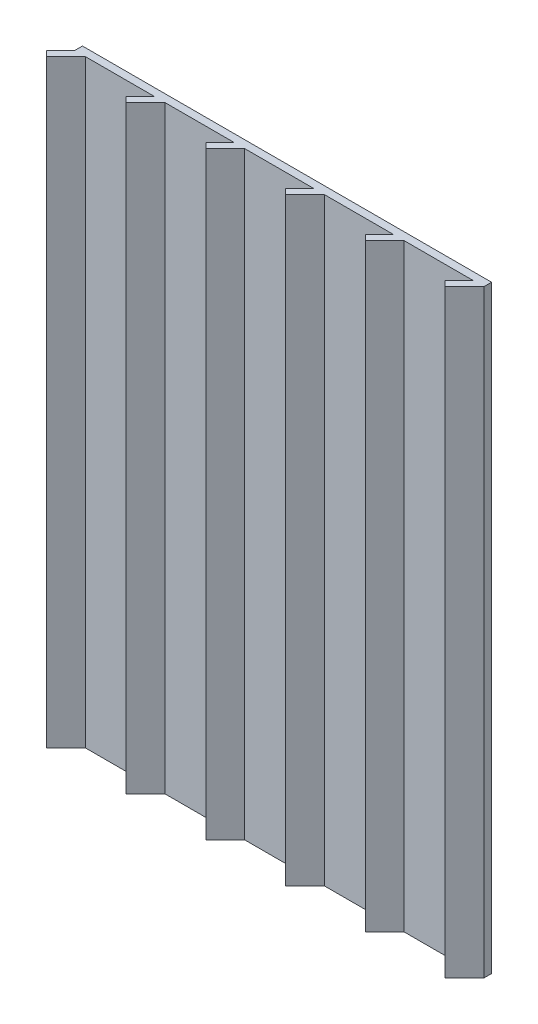
ISO-10303-21;
HEADER;
FILE_DESCRIPTION(('STEP AP214'),'2;1');
FILE_NAME('part.step','',(''),(''),'','','');
FILE_SCHEMA(('AUTOMOTIVE_DESIGN { 1 0 10303 214 1 1 1 1 }'));
ENDSEC;
DATA;
#1=APPLICATION_CONTEXT('core data for automotive mechanical design processes');
#2=APPLICATION_PROTOCOL_DEFINITION('international standard','automotive_design',2000,#1);
#3=PRODUCT_CONTEXT('',#1,'mechanical');
#4=PRODUCT('Part','Part','',(#3));
#5=PRODUCT_RELATED_PRODUCT_CATEGORY('part','',(#4));
#6=PRODUCT_DEFINITION_FORMATION('','',#4);
#7=PRODUCT_DEFINITION_CONTEXT('part definition',#1,'design');
#8=PRODUCT_DEFINITION('design','',#6,#7);
#9=PRODUCT_DEFINITION_SHAPE('','',#8);
#10=(LENGTH_UNIT() NAMED_UNIT(*) SI_UNIT(.MILLI.,.METRE.));
#11=(NAMED_UNIT(*) PLANE_ANGLE_UNIT() SI_UNIT($,.RADIAN.));
#12=(NAMED_UNIT(*) SI_UNIT($,.STERADIAN.) SOLID_ANGLE_UNIT());
#13=UNCERTAINTY_MEASURE_WITH_UNIT(LENGTH_MEASURE(1.E-05),#10,'distance_accuracy_value','');
#14=(GEOMETRIC_REPRESENTATION_CONTEXT(3) GLOBAL_UNCERTAINTY_ASSIGNED_CONTEXT((#13)) GLOBAL_UNIT_ASSIGNED_CONTEXT((#10,
#11,#12)) REPRESENTATION_CONTEXT('',''));
#15=CARTESIAN_POINT('',(0.,0.,0.));
#16=DIRECTION('',(0.,0.,1.));
#17=DIRECTION('',(1.,0.,0.));
#18=AXIS2_PLACEMENT_3D('',#15,#16,#17);
#19=CARTESIAN_POINT('',(-2.06748602975986,-25.4,1.0795));
#20=DIRECTION('',(0.707106781186547,0.,0.707106781186548));
#21=DIRECTION('',(0.707106781186548,0.,-0.707106781186547));
#22=AXIS2_PLACEMENT_3D('',#19,#20,#21);
#23=PLANE('',#22);
#24=DIRECTION('',(0.707106781186548,0.,-0.707106781186547));
#25=VECTOR('',#24,1.);
#26=CARTESIAN_POINT('',(-2.06748602975986,25.4,1.0795));
#27=LINE('',#26,#25);
#28=CARTESIAN_POINT('',(-2.89298602975984,25.4,1.905));
#29=VERTEX_POINT('',#28);
#30=CARTESIAN_POINT('',(-1.24198602975986,25.4,0.254));
#31=VERTEX_POINT('',#30);
#32=EDGE_CURVE('E317',#29,#31,#27,.T.);
#33=ORIENTED_EDGE('',*,*,#32,.F.);
#34=DIRECTION('',(0.,1.,0.));
#35=VECTOR('',#34,1.);
#36=CARTESIAN_POINT('',(-2.89298602975984,-25.4,1.905));
#37=LINE('',#36,#35);
#38=CARTESIAN_POINT('',(-2.89298602975984,-25.4,1.905));
#39=VERTEX_POINT('',#38);
#40=EDGE_CURVE('E314',#39,#29,#37,.T.);
#41=ORIENTED_EDGE('',*,*,#40,.F.);
#42=DIRECTION('',(0.707106781186548,0.,-0.707106781186547));
#43=VECTOR('',#42,1.);
#44=CARTESIAN_POINT('',(-2.06748602975986,-25.4,1.0795));
#45=LINE('',#44,#43);
#46=CARTESIAN_POINT('',(-1.24198602975986,-25.4,0.254));
#47=VERTEX_POINT('',#46);
#48=EDGE_CURVE('E311',#39,#47,#45,.T.);
#49=ORIENTED_EDGE('',*,*,#48,.T.);
#50=DIRECTION('',(0.,1.,0.));
#51=VECTOR('',#50,1.);
#52=CARTESIAN_POINT('',(-1.24198602975986,-25.4,0.254));
#53=LINE('',#52,#51);
#54=EDGE_CURVE('E11',#47,#31,#53,.T.);
#55=ORIENTED_EDGE('',*,*,#54,.T.);
#56=EDGE_LOOP('',(#33,#41,#49,#55));
#57=FACE_BOUND('',#56,.T.);
#58=ADVANCED_FACE('F45',(#57),#23,.T.);
#59=CARTESIAN_POINT('',(-3.11749243278657,-25.4,1.68049359697328));
#60=DIRECTION('',(0.707106781186548,0.,-0.707106781186547));
#61=DIRECTION('',(-0.707106781186547,0.,-0.707106781186548));
#62=AXIS2_PLACEMENT_3D('',#59,#60,#61);
#63=PLANE('',#62);
#64=DIRECTION('',(-0.707106781186547,0.,-0.707106781186548));
#65=VECTOR('',#64,1.);
#66=CARTESIAN_POINT('',(-3.11749243278657,25.4,1.68049359697328));
#67=LINE('',#66,#65);
#68=CARTESIAN_POINT('',(-3.3419988358133,25.4,1.45598719394654));
#69=VERTEX_POINT('',#68);
#70=EDGE_CURVE('E309',#29,#69,#67,.T.);
#71=ORIENTED_EDGE('',*,*,#70,.T.);
#72=DIRECTION('',(0.,1.,0.));
#73=VECTOR('',#72,1.);
#74=CARTESIAN_POINT('',(-3.3419988358133,-25.4,1.45598719394654));
#75=LINE('',#74,#73);
#76=CARTESIAN_POINT('',(-3.3419988358133,-25.4,1.45598719394654));
#77=VERTEX_POINT('',#76);
#78=EDGE_CURVE('E306',#77,#69,#75,.T.);
#79=ORIENTED_EDGE('',*,*,#78,.F.);
#80=DIRECTION('',(-0.707106781186547,0.,-0.707106781186548));
#81=VECTOR('',#80,1.);
#82=CARTESIAN_POINT('',(-3.11749243278657,-25.4,1.68049359697328));
#83=LINE('',#82,#81);
#84=EDGE_CURVE('E303',#39,#77,#83,.T.);
#85=ORIENTED_EDGE('',*,*,#84,.F.);
#86=ORIENTED_EDGE('',*,*,#40,.T.);
#87=EDGE_LOOP('',(#71,#79,#85,#86));
#88=FACE_BOUND('',#87,.T.);
#89=ADVANCED_FACE('F465',(#88),#63,.F.);
#90=CARTESIAN_POINT('',(-2.74100523884004,-25.4,0.854993596973269));
#91=DIRECTION('',(0.707106781186547,0.,0.707106781186548));
#92=DIRECTION('',(0.707106781186548,0.,-0.707106781186547));
#93=AXIS2_PLACEMENT_3D('',#90,#91,#92);
#94=PLANE('',#93);
#95=DIRECTION('',(0.707106781186548,0.,-0.707106781186547));
#96=VECTOR('',#95,1.);
#97=CARTESIAN_POINT('',(-2.74100523884004,25.4,0.854993596973269));
#98=LINE('',#97,#96);
#99=CARTESIAN_POINT('',(-2.14001164186677,25.4,0.254));
#100=VERTEX_POINT('',#99);
#101=EDGE_CURVE('E300',#69,#100,#98,.T.);
#102=ORIENTED_EDGE('',*,*,#101,.T.);
#103=DIRECTION('',(0.,1.,0.));
#104=VECTOR('',#103,1.);
#105=CARTESIAN_POINT('',(-2.14001164186677,-25.4,0.254));
#106=LINE('',#105,#104);
#107=CARTESIAN_POINT('',(-2.14001164186677,-25.4,0.254));
#108=VERTEX_POINT('',#107);
#109=EDGE_CURVE('E297',#108,#100,#106,.T.);
#110=ORIENTED_EDGE('',*,*,#109,.F.);
#111=DIRECTION('',(0.707106781186548,0.,-0.707106781186547));
#112=VECTOR('',#111,1.);
#113=CARTESIAN_POINT('',(-2.74100523884004,-25.4,0.854993596973269));
#114=LINE('',#113,#112);
#115=EDGE_CURVE('E294',#77,#108,#114,.T.);
#116=ORIENTED_EDGE('',*,*,#115,.F.);
#117=ORIENTED_EDGE('',*,*,#78,.T.);
#118=EDGE_LOOP('',(#102,#110,#116,#117));
#119=FACE_BOUND('',#118,.T.);
#120=ADVANCED_FACE('F462',(#119),#94,.F.);
#121=CARTESIAN_POINT('',(-6.76399534325328,-25.4,0.254));
#122=DIRECTION('',(0.,0.,1.));
#123=DIRECTION('',(1.,0.,0.));
#124=AXIS2_PLACEMENT_3D('',#121,#122,#123);
#125=PLANE('',#124);
#126=DIRECTION('',(0.,1.,0.));
#127=VECTOR('',#126,1.);
#128=CARTESIAN_POINT('',(-8.00598137301315,-25.4,0.254000000000008));
#129=LINE('',#128,#127);
#130=CARTESIAN_POINT('',(-8.00598137301315,-25.4,0.254000000000008));
#131=VERTEX_POINT('',#130);
#132=CARTESIAN_POINT('',(-8.00598137301315,25.4,0.254000000000008));
#133=VERTEX_POINT('',#132);
#134=EDGE_CURVE('E287',#131,#133,#129,.T.);
#135=ORIENTED_EDGE('',*,*,#134,.F.);
#136=DIRECTION('',(1.,0.,0.));
#137=VECTOR('',#136,1.);
#138=CARTESIAN_POINT('',(-3.38199767162663,-25.4,0.254));
#139=LINE('',#138,#137);
#140=EDGE_CURVE('E292',#131,#108,#139,.T.);
#141=ORIENTED_EDGE('',*,*,#140,.T.);
#142=ORIENTED_EDGE('',*,*,#109,.T.);
#143=DIRECTION('',(1.,0.,0.));
#144=VECTOR('',#143,1.);
#145=CARTESIAN_POINT('',(-6.76399534325328,25.4,0.254));
#146=LINE('',#145,#144);
#147=EDGE_CURVE('E290',#133,#100,#146,.T.);
#148=ORIENTED_EDGE('',*,*,#147,.F.);
#149=EDGE_LOOP('',(#135,#141,#142,#148));
#150=FACE_BOUND('',#149,.T.);
#151=ADVANCED_FACE('F458',(#150),#125,.T.);
#152=CARTESIAN_POINT('',(-8.83148137301314,-25.4,1.0795));
#153=DIRECTION('',(0.707106781186548,0.,0.707106781186547));
#154=DIRECTION('',(0.707106781186547,0.,-0.707106781186548));
#155=AXIS2_PLACEMENT_3D('',#152,#153,#154);
#156=PLANE('',#155);
#157=DIRECTION('',(0.707106781186547,0.,-0.707106781186548));
#158=VECTOR('',#157,1.);
#159=CARTESIAN_POINT('',(-8.83148137301314,25.4,1.0795));
#160=LINE('',#159,#158);
#161=CARTESIAN_POINT('',(-9.65698137301311,25.4,1.905));
#162=VERTEX_POINT('',#161);
#163=EDGE_CURVE('E284',#162,#133,#160,.T.);
#164=ORIENTED_EDGE('',*,*,#163,.F.);
#165=DIRECTION('',(0.,1.,0.));
#166=VECTOR('',#165,1.);
#167=CARTESIAN_POINT('',(-9.65698137301311,-25.4,1.905));
#168=LINE('',#167,#166);
#169=CARTESIAN_POINT('',(-9.65698137301311,-25.4,1.905));
#170=VERTEX_POINT('',#169);
#171=EDGE_CURVE('E281',#170,#162,#168,.T.);
#172=ORIENTED_EDGE('',*,*,#171,.F.);
#173=DIRECTION('',(0.707106781186547,0.,-0.707106781186548));
#174=VECTOR('',#173,1.);
#175=CARTESIAN_POINT('',(-8.83148137301314,-25.4,1.0795));
#176=LINE('',#175,#174);
#177=EDGE_CURVE('E278',#170,#131,#176,.T.);
#178=ORIENTED_EDGE('',*,*,#177,.T.);
#179=ORIENTED_EDGE('',*,*,#134,.T.);
#180=EDGE_LOOP('',(#164,#172,#178,#179));
#181=FACE_BOUND('',#180,.T.);
#182=ADVANCED_FACE('F455',(#181),#156,.T.);
#183=CARTESIAN_POINT('',(-9.88148777603984,-25.4,1.68049359697327));
#184=DIRECTION('',(0.707106781186548,0.,-0.707106781186547));
#185=DIRECTION('',(-0.707106781186547,0.,-0.707106781186548));
#186=AXIS2_PLACEMENT_3D('',#183,#184,#185);
#187=PLANE('',#186);
#188=DIRECTION('',(-0.707106781186547,0.,-0.707106781186548));
#189=VECTOR('',#188,1.);
#190=CARTESIAN_POINT('',(-9.88148777603984,25.4,1.68049359697327));
#191=LINE('',#190,#189);
#192=CARTESIAN_POINT('',(-10.1059941790666,25.4,1.45598719394653));
#193=VERTEX_POINT('',#192);
#194=EDGE_CURVE('E276',#162,#193,#191,.T.);
#195=ORIENTED_EDGE('',*,*,#194,.T.);
#196=DIRECTION('',(0.,1.,0.));
#197=VECTOR('',#196,1.);
#198=CARTESIAN_POINT('',(-10.1059941790666,-25.4,1.45598719394653));
#199=LINE('',#198,#197);
#200=CARTESIAN_POINT('',(-10.1059941790666,-25.4,1.45598719394653));
#201=VERTEX_POINT('',#200);
#202=EDGE_CURVE('E273',#201,#193,#199,.T.);
#203=ORIENTED_EDGE('',*,*,#202,.F.);
#204=DIRECTION('',(-0.707106781186547,0.,-0.707106781186548));
#205=VECTOR('',#204,1.);
#206=CARTESIAN_POINT('',(-9.88148777603984,-25.4,1.68049359697327));
#207=LINE('',#206,#205);
#208=EDGE_CURVE('E270',#170,#201,#207,.T.);
#209=ORIENTED_EDGE('',*,*,#208,.F.);
#210=ORIENTED_EDGE('',*,*,#171,.T.);
#211=EDGE_LOOP('',(#195,#203,#209,#210));
#212=FACE_BOUND('',#211,.T.);
#213=ADVANCED_FACE('F451',(#212),#187,.F.);
#214=CARTESIAN_POINT('',(-9.50500058209333,-25.4,0.854993596973268));
#215=DIRECTION('',(0.707106781186547,0.,0.707106781186548));
#216=DIRECTION('',(0.707106781186548,0.,-0.707106781186547));
#217=AXIS2_PLACEMENT_3D('',#214,#215,#216);
#218=PLANE('',#217);
#219=DIRECTION('',(0.707106781186548,0.,-0.707106781186547));
#220=VECTOR('',#219,1.);
#221=CARTESIAN_POINT('',(-9.50500058209333,25.4,0.854993596973268));
#222=LINE('',#221,#220);
#223=CARTESIAN_POINT('',(-8.90400698512006,25.4,0.254));
#224=VERTEX_POINT('',#223);
#225=EDGE_CURVE('E267',#193,#224,#222,.T.);
#226=ORIENTED_EDGE('',*,*,#225,.T.);
#227=DIRECTION('',(0.,1.,0.));
#228=VECTOR('',#227,1.);
#229=CARTESIAN_POINT('',(-8.90400698512006,-25.4,0.254));
#230=LINE('',#229,#228);
#231=CARTESIAN_POINT('',(-8.90400698512006,-25.4,0.254));
#232=VERTEX_POINT('',#231);
#233=EDGE_CURVE('E264',#232,#224,#230,.T.);
#234=ORIENTED_EDGE('',*,*,#233,.F.);
#235=DIRECTION('',(0.707106781186548,0.,-0.707106781186547));
#236=VECTOR('',#235,1.);
#237=CARTESIAN_POINT('',(-9.50500058209333,-25.4,0.854993596973268));
#238=LINE('',#237,#236);
#239=EDGE_CURVE('E261',#201,#232,#238,.T.);
#240=ORIENTED_EDGE('',*,*,#239,.F.);
#241=ORIENTED_EDGE('',*,*,#202,.T.);
#242=EDGE_LOOP('',(#226,#234,#240,#241));
#243=FACE_BOUND('',#242,.T.);
#244=ADVANCED_FACE('F447',(#243),#218,.F.);
#245=CARTESIAN_POINT('',(-13.5279906865066,-25.4,0.254));
#246=DIRECTION('',(0.,0.,1.));
#247=DIRECTION('',(1.,0.,0.));
#248=AXIS2_PLACEMENT_3D('',#245,#246,#247);
#249=PLANE('',#248);
#250=DIRECTION('',(0.,1.,0.));
#251=VECTOR('',#250,1.);
#252=CARTESIAN_POINT('',(-14.7699767162664,-25.4,0.254000000000007));
#253=LINE('',#252,#251);
#254=CARTESIAN_POINT('',(-14.7699767162664,-25.4,0.254000000000007));
#255=VERTEX_POINT('',#254);
#256=CARTESIAN_POINT('',(-14.7699767162664,25.4,0.254000000000007));
#257=VERTEX_POINT('',#256);
#258=EDGE_CURVE('E254',#255,#257,#253,.T.);
#259=ORIENTED_EDGE('',*,*,#258,.F.);
#260=DIRECTION('',(1.,0.,0.));
#261=VECTOR('',#260,1.);
#262=CARTESIAN_POINT('',(-10.1459930148799,-25.4,0.254));
#263=LINE('',#262,#261);
#264=EDGE_CURVE('E259',#255,#232,#263,.T.);
#265=ORIENTED_EDGE('',*,*,#264,.T.);
#266=ORIENTED_EDGE('',*,*,#233,.T.);
#267=DIRECTION('',(1.,0.,0.));
#268=VECTOR('',#267,1.);
#269=CARTESIAN_POINT('',(-13.5279906865066,25.4,0.254));
#270=LINE('',#269,#268);
#271=EDGE_CURVE('E257',#257,#224,#270,.T.);
#272=ORIENTED_EDGE('',*,*,#271,.F.);
#273=EDGE_LOOP('',(#259,#265,#266,#272));
#274=FACE_BOUND('',#273,.T.);
#275=ADVANCED_FACE('F443',(#274),#249,.T.);
#276=CARTESIAN_POINT('',(-15.5954767162665,-25.4,1.0795));
#277=DIRECTION('',(0.707106781186548,0.,0.707106781186547));
#278=DIRECTION('',(0.707106781186547,0.,-0.707106781186548));
#279=AXIS2_PLACEMENT_3D('',#276,#277,#278);
#280=PLANE('',#279);
#281=DIRECTION('',(0.707106781186547,0.,-0.707106781186548));
#282=VECTOR('',#281,1.);
#283=CARTESIAN_POINT('',(-15.5954767162665,25.4,1.0795));
#284=LINE('',#283,#282);
#285=CARTESIAN_POINT('',(-16.4209767162664,25.4,1.905));
#286=VERTEX_POINT('',#285);
#287=EDGE_CURVE('E251',#286,#257,#284,.T.);
#288=ORIENTED_EDGE('',*,*,#287,.F.);
#289=DIRECTION('',(0.,1.,0.));
#290=VECTOR('',#289,1.);
#291=CARTESIAN_POINT('',(-16.4209767162664,-25.4,1.905));
#292=LINE('',#291,#290);
#293=CARTESIAN_POINT('',(-16.4209767162664,-25.4,1.905));
#294=VERTEX_POINT('',#293);
#295=EDGE_CURVE('E248',#294,#286,#292,.T.);
#296=ORIENTED_EDGE('',*,*,#295,.F.);
#297=DIRECTION('',(0.707106781186547,0.,-0.707106781186548));
#298=VECTOR('',#297,1.);
#299=CARTESIAN_POINT('',(-15.5954767162665,-25.4,1.0795));
#300=LINE('',#299,#298);
#301=EDGE_CURVE('E245',#294,#255,#300,.T.);
#302=ORIENTED_EDGE('',*,*,#301,.T.);
#303=ORIENTED_EDGE('',*,*,#258,.T.);
#304=EDGE_LOOP('',(#288,#296,#302,#303));
#305=FACE_BOUND('',#304,.T.);
#306=ADVANCED_FACE('F440',(#305),#280,.T.);
#307=CARTESIAN_POINT('',(-16.6454831192932,-25.4,1.68049359697327));
#308=DIRECTION('',(0.707106781186548,0.,-0.707106781186547));
#309=DIRECTION('',(-0.707106781186547,0.,-0.707106781186548));
#310=AXIS2_PLACEMENT_3D('',#307,#308,#309);
#311=PLANE('',#310);
#312=DIRECTION('',(-0.707106781186547,0.,-0.707106781186548));
#313=VECTOR('',#312,1.);
#314=CARTESIAN_POINT('',(-16.6454831192932,25.4,1.68049359697327));
#315=LINE('',#314,#313);
#316=CARTESIAN_POINT('',(-16.8699895223198,25.4,1.45598719394653));
#317=VERTEX_POINT('',#316);
#318=EDGE_CURVE('E243',#286,#317,#315,.T.);
#319=ORIENTED_EDGE('',*,*,#318,.T.);
#320=DIRECTION('',(0.,1.,0.));
#321=VECTOR('',#320,1.);
#322=CARTESIAN_POINT('',(-16.8699895223198,-25.4,1.45598719394653));
#323=LINE('',#322,#321);
#324=CARTESIAN_POINT('',(-16.8699895223198,-25.4,1.45598719394653));
#325=VERTEX_POINT('',#324);
#326=EDGE_CURVE('E235',#325,#317,#323,.T.);
#327=ORIENTED_EDGE('',*,*,#326,.F.);
#328=DIRECTION('',(-0.707106781186547,0.,-0.707106781186548));
#329=VECTOR('',#328,1.);
#330=CARTESIAN_POINT('',(-16.6454831192932,-25.4,1.68049359697327));
#331=LINE('',#330,#329);
#332=EDGE_CURVE('E236',#294,#325,#331,.T.);
#333=ORIENTED_EDGE('',*,*,#332,.F.);
#334=ORIENTED_EDGE('',*,*,#295,.T.);
#335=EDGE_LOOP('',(#319,#327,#333,#334));
#336=FACE_BOUND('',#335,.T.);
#337=ADVANCED_FACE('F437',(#336),#311,.F.);
#338=CARTESIAN_POINT('',(-16.2689959253466,-25.4,0.854993596973267));
#339=DIRECTION('',(0.707106781186547,0.,0.707106781186548));
#340=DIRECTION('',(0.707106781186548,0.,-0.707106781186547));
#341=AXIS2_PLACEMENT_3D('',#338,#339,#340);
#342=PLANE('',#341);
#343=DIRECTION('',(0.707106781186548,0.,-0.707106781186547));
#344=VECTOR('',#343,1.);
#345=CARTESIAN_POINT('',(-16.2689959253466,25.4,0.854993596973267));
#346=LINE('',#345,#344);
#347=CARTESIAN_POINT('',(-15.6680023283733,25.4,0.254));
#348=VERTEX_POINT('',#347);
#349=EDGE_CURVE('E222',#317,#348,#346,.T.);
#350=ORIENTED_EDGE('',*,*,#349,.T.);
#351=DIRECTION('',(0.,1.,0.));
#352=VECTOR('',#351,1.);
#353=CARTESIAN_POINT('',(-15.6680023283733,-25.4,0.254));
#354=LINE('',#353,#352);
#355=CARTESIAN_POINT('',(-15.6680023283733,-25.4,0.254));
#356=VERTEX_POINT('',#355);
#357=EDGE_CURVE('E214',#356,#348,#354,.T.);
#358=ORIENTED_EDGE('',*,*,#357,.F.);
#359=DIRECTION('',(0.707106781186548,0.,-0.707106781186547));
#360=VECTOR('',#359,1.);
#361=CARTESIAN_POINT('',(-16.2689959253466,-25.4,0.854993596973267));
#362=LINE('',#361,#360);
#363=EDGE_CURVE('E223',#325,#356,#362,.T.);
#364=ORIENTED_EDGE('',*,*,#363,.F.);
#365=ORIENTED_EDGE('',*,*,#326,.T.);
#366=EDGE_LOOP('',(#350,#358,#364,#365));
#367=FACE_BOUND('',#366,.T.);
#368=ADVANCED_FACE('F234',(#367),#342,.F.);
#369=CARTESIAN_POINT('',(19.05,-25.4,0.127));
#370=DIRECTION('',(1.,0.,0.));
#371=DIRECTION('',(0.,0.,-1.));
#372=AXIS2_PLACEMENT_3D('',#369,#370,#371);
#373=PLANE('',#372);
#374=DIRECTION('',(0.,0.,-1.));
#375=VECTOR('',#374,1.);
#376=CARTESIAN_POINT('',(19.05,25.4,0.127));
#377=LINE('',#376,#375);
#378=CARTESIAN_POINT('',(19.05,25.4,0.254000000000018));
#379=VERTEX_POINT('',#378);
#380=CARTESIAN_POINT('',(19.05,25.4,-0.400000000000001));
#381=VERTEX_POINT('',#380);
#382=EDGE_CURVE('E431',#379,#381,#377,.T.);
#383=ORIENTED_EDGE('',*,*,#382,.F.);
#384=DIRECTION('',(0.,1.,0.));
#385=VECTOR('',#384,1.);
#386=CARTESIAN_POINT('',(19.05,-25.4,0.254000000000018));
#387=LINE('',#386,#385);
#388=CARTESIAN_POINT('',(19.05,-25.4,0.254000000000018));
#389=VERTEX_POINT('',#388);
#390=EDGE_CURVE('E428',#389,#379,#387,.T.);
#391=ORIENTED_EDGE('',*,*,#390,.F.);
#392=DIRECTION('',(0.,0.,-1.));
#393=VECTOR('',#392,1.);
#394=CARTESIAN_POINT('',(19.05,-25.4,0.127));
#395=LINE('',#394,#393);
#396=CARTESIAN_POINT('',(19.05,-25.4,-0.400000000000001));
#397=VERTEX_POINT('',#396);
#398=EDGE_CURVE('E426',#389,#397,#395,.T.);
#399=ORIENTED_EDGE('',*,*,#398,.T.);
#400=DIRECTION('',(0.,1.,0.));
#401=VECTOR('',#400,1.);
#402=CARTESIAN_POINT('',(19.05,-63.5020996796765,-0.400000000000001));
#403=LINE('',#402,#401);
#404=EDGE_CURVE('E723',#397,#381,#403,.T.);
#405=ORIENTED_EDGE('',*,*,#404,.T.);
#406=EDGE_LOOP('',(#383,#391,#399,#405));
#407=FACE_BOUND('',#406,.T.);
#408=ADVANCED_FACE('F495',(#407),#373,.T.);
#409=CARTESIAN_POINT('',(18.2245,-25.4,1.07950000000001));
#410=DIRECTION('',(0.707106781186548,0.,0.707106781186548));
#411=DIRECTION('',(0.707106781186548,0.,-0.707106781186548));
#412=AXIS2_PLACEMENT_3D('',#409,#410,#411);
#413=PLANE('',#412);
#414=DIRECTION('',(0.707106781186548,0.,-0.707106781186548));
#415=VECTOR('',#414,1.);
#416=CARTESIAN_POINT('',(18.2245,25.4,1.07950000000001));
#417=LINE('',#416,#415);
#418=CARTESIAN_POINT('',(17.399,25.4,1.905));
#419=VERTEX_POINT('',#418);
#420=EDGE_CURVE('E423',#419,#379,#417,.T.);
#421=ORIENTED_EDGE('',*,*,#420,.F.);
#422=DIRECTION('',(0.,1.,0.));
#423=VECTOR('',#422,1.);
#424=CARTESIAN_POINT('',(17.399,-25.4,1.905));
#425=LINE('',#424,#423);
#426=CARTESIAN_POINT('',(17.399,-25.4,1.905));
#427=VERTEX_POINT('',#426);
#428=EDGE_CURVE('E420',#427,#419,#425,.T.);
#429=ORIENTED_EDGE('',*,*,#428,.F.);
#430=DIRECTION('',(0.707106781186548,0.,-0.707106781186548));
#431=VECTOR('',#430,1.);
#432=CARTESIAN_POINT('',(18.2245,-25.4,1.07950000000001));
#433=LINE('',#432,#431);
#434=EDGE_CURVE('E417',#427,#389,#433,.T.);
#435=ORIENTED_EDGE('',*,*,#434,.T.);
#436=ORIENTED_EDGE('',*,*,#390,.T.);
#437=EDGE_LOOP('',(#421,#429,#435,#436));
#438=FACE_BOUND('',#437,.T.);
#439=ADVANCED_FACE('F498',(#438),#413,.T.);
#440=CARTESIAN_POINT('',(17.1744935969733,-25.4,1.68049359697327));
#441=DIRECTION('',(0.707106781186548,0.,-0.707106781186547));
#442=DIRECTION('',(-0.707106781186547,0.,-0.707106781186548));
#443=AXIS2_PLACEMENT_3D('',#440,#441,#442);
#444=PLANE('',#443);
#445=DIRECTION('',(-0.707106781186547,0.,-0.707106781186548));
#446=VECTOR('',#445,1.);
#447=CARTESIAN_POINT('',(17.1744935969733,25.4,1.68049359697327));
#448=LINE('',#447,#446);
#449=CARTESIAN_POINT('',(16.9499871939465,25.4,1.45598719394653));
#450=VERTEX_POINT('',#449);
#451=EDGE_CURVE('E415',#419,#450,#448,.T.);
#452=ORIENTED_EDGE('',*,*,#451,.T.);
#453=DIRECTION('',(0.,1.,0.));
#454=VECTOR('',#453,1.);
#455=CARTESIAN_POINT('',(16.9499871939465,-25.4,1.45598719394653));
#456=LINE('',#455,#454);
#457=CARTESIAN_POINT('',(16.9499871939465,-25.4,1.45598719394653));
#458=VERTEX_POINT('',#457);
#459=EDGE_CURVE('E412',#458,#450,#456,.T.);
#460=ORIENTED_EDGE('',*,*,#459,.F.);
#461=DIRECTION('',(-0.707106781186547,0.,-0.707106781186548));
#462=VECTOR('',#461,1.);
#463=CARTESIAN_POINT('',(17.1744935969733,-25.4,1.68049359697327));
#464=LINE('',#463,#462);
#465=EDGE_CURVE('E409',#427,#458,#464,.T.);
#466=ORIENTED_EDGE('',*,*,#465,.F.);
#467=ORIENTED_EDGE('',*,*,#428,.T.);
#468=EDGE_LOOP('',(#452,#460,#466,#467));
#469=FACE_BOUND('',#468,.T.);
#470=ADVANCED_FACE('F502',(#469),#444,.F.);
#471=CARTESIAN_POINT('',(17.5509807909198,-25.4,0.854993596973271));
#472=DIRECTION('',(0.707106781186548,0.,0.707106781186548));
#473=DIRECTION('',(0.707106781186548,0.,-0.707106781186548));
#474=AXIS2_PLACEMENT_3D('',#471,#472,#473);
#475=PLANE('',#474);
#476=DIRECTION('',(0.707106781186548,0.,-0.707106781186548));
#477=VECTOR('',#476,1.);
#478=CARTESIAN_POINT('',(17.5509807909198,25.4,0.854993596973271));
#479=LINE('',#478,#477);
#480=CARTESIAN_POINT('',(18.1519743878931,25.4,0.254000000000006));
#481=VERTEX_POINT('',#480);
#482=EDGE_CURVE('E406',#450,#481,#479,.T.);
#483=ORIENTED_EDGE('',*,*,#482,.T.);
#484=DIRECTION('',(0.,1.,0.));
#485=VECTOR('',#484,1.);
#486=CARTESIAN_POINT('',(18.1519743878931,-25.4,0.254000000000006));
#487=LINE('',#486,#485);
#488=CARTESIAN_POINT('',(18.1519743878931,-25.4,0.254000000000006));
#489=VERTEX_POINT('',#488);
#490=EDGE_CURVE('E403',#489,#481,#487,.T.);
#491=ORIENTED_EDGE('',*,*,#490,.F.);
#492=DIRECTION('',(0.707106781186548,0.,-0.707106781186548));
#493=VECTOR('',#492,1.);
#494=CARTESIAN_POINT('',(17.5509807909198,-25.4,0.854993596973271));
#495=LINE('',#494,#493);
#496=EDGE_CURVE('E400',#458,#489,#495,.T.);
#497=ORIENTED_EDGE('',*,*,#496,.F.);
#498=ORIENTED_EDGE('',*,*,#459,.T.);
#499=EDGE_LOOP('',(#483,#491,#497,#498));
#500=FACE_BOUND('',#499,.T.);
#501=ADVANCED_FACE('F506',(#500),#475,.F.);
#502=CARTESIAN_POINT('',(13.5279906865066,-25.4,0.254000000000004));
#503=DIRECTION('',(0.,0.,1.));
#504=DIRECTION('',(1.,0.,0.));
#505=AXIS2_PLACEMENT_3D('',#502,#503,#504);
#506=PLANE('',#505);
#507=DIRECTION('',(0.,1.,0.));
#508=VECTOR('',#507,1.);
#509=CARTESIAN_POINT('',(12.2860046567467,-25.4,0.254000000000004));
#510=LINE('',#509,#508);
#511=CARTESIAN_POINT('',(12.2860046567467,-25.4,0.254000000000004));
#512=VERTEX_POINT('',#511);
#513=CARTESIAN_POINT('',(12.2860046567467,25.4,0.254000000000004));
#514=VERTEX_POINT('',#513);
#515=EDGE_CURVE('E393',#512,#514,#510,.T.);
#516=ORIENTED_EDGE('',*,*,#515,.F.);
#517=DIRECTION('',(-1.,0.,0.));
#518=VECTOR('',#517,1.);
#519=CARTESIAN_POINT('',(16.9099883581332,-25.4,0.254000000000006));
#520=LINE('',#519,#518);
#521=EDGE_CURVE('E398',#489,#512,#520,.T.);
#522=ORIENTED_EDGE('',*,*,#521,.F.);
#523=ORIENTED_EDGE('',*,*,#490,.T.);
#524=DIRECTION('',(1.,0.,0.));
#525=VECTOR('',#524,1.);
#526=CARTESIAN_POINT('',(13.5279906865066,25.4,0.254000000000004));
#527=LINE('',#526,#525);
#528=EDGE_CURVE('E396',#514,#481,#527,.T.);
#529=ORIENTED_EDGE('',*,*,#528,.F.);
#530=EDGE_LOOP('',(#516,#522,#523,#529));
#531=FACE_BOUND('',#530,.T.);
#532=ADVANCED_FACE('F510',(#531),#506,.T.);
#533=CARTESIAN_POINT('',(11.4605046567467,-25.4,1.0795));
#534=DIRECTION('',(0.707106781186548,0.,0.707106781186548));
#535=DIRECTION('',(0.707106781186548,0.,-0.707106781186548));
#536=AXIS2_PLACEMENT_3D('',#533,#534,#535);
#537=PLANE('',#536);
#538=DIRECTION('',(0.707106781186548,0.,-0.707106781186548));
#539=VECTOR('',#538,1.);
#540=CARTESIAN_POINT('',(11.4605046567467,25.4,1.0795));
#541=LINE('',#540,#539);
#542=CARTESIAN_POINT('',(10.6350046567467,25.4,1.905));
#543=VERTEX_POINT('',#542);
#544=EDGE_CURVE('E390',#543,#514,#541,.T.);
#545=ORIENTED_EDGE('',*,*,#544,.F.);
#546=DIRECTION('',(0.,1.,0.));
#547=VECTOR('',#546,1.);
#548=CARTESIAN_POINT('',(10.6350046567467,-25.4,1.905));
#549=LINE('',#548,#547);
#550=CARTESIAN_POINT('',(10.6350046567467,-25.4,1.905));
#551=VERTEX_POINT('',#550);
#552=EDGE_CURVE('E387',#551,#543,#549,.T.);
#553=ORIENTED_EDGE('',*,*,#552,.F.);
#554=DIRECTION('',(0.707106781186548,0.,-0.707106781186548));
#555=VECTOR('',#554,1.);
#556=CARTESIAN_POINT('',(11.4605046567467,-25.4,1.0795));
#557=LINE('',#556,#555);
#558=EDGE_CURVE('E384',#551,#512,#557,.T.);
#559=ORIENTED_EDGE('',*,*,#558,.T.);
#560=ORIENTED_EDGE('',*,*,#515,.T.);
#561=EDGE_LOOP('',(#545,#553,#559,#560));
#562=FACE_BOUND('',#561,.T.);
#563=ADVANCED_FACE('F514',(#562),#537,.T.);
#564=CARTESIAN_POINT('',(10.41049825372,-25.4,1.68049359697327));
#565=DIRECTION('',(0.707106781186548,0.,-0.707106781186547));
#566=DIRECTION('',(-0.707106781186547,0.,-0.707106781186548));
#567=AXIS2_PLACEMENT_3D('',#564,#565,#566);
#568=PLANE('',#567);
#569=DIRECTION('',(-0.707106781186547,0.,-0.707106781186548));
#570=VECTOR('',#569,1.);
#571=CARTESIAN_POINT('',(10.41049825372,25.4,1.68049359697327));
#572=LINE('',#571,#570);
#573=CARTESIAN_POINT('',(10.1859918506933,25.4,1.45598719394653));
#574=VERTEX_POINT('',#573);
#575=EDGE_CURVE('E382',#543,#574,#572,.T.);
#576=ORIENTED_EDGE('',*,*,#575,.T.);
#577=DIRECTION('',(0.,1.,0.));
#578=VECTOR('',#577,1.);
#579=CARTESIAN_POINT('',(10.1859918506933,-25.4,1.45598719394653));
#580=LINE('',#579,#578);
#581=CARTESIAN_POINT('',(10.1859918506933,-25.4,1.45598719394653));
#582=VERTEX_POINT('',#581);
#583=EDGE_CURVE('E379',#582,#574,#580,.T.);
#584=ORIENTED_EDGE('',*,*,#583,.F.);
#585=DIRECTION('',(-0.707106781186547,0.,-0.707106781186548));
#586=VECTOR('',#585,1.);
#587=CARTESIAN_POINT('',(10.41049825372,-25.4,1.68049359697327));
#588=LINE('',#587,#586);
#589=EDGE_CURVE('E376',#551,#582,#588,.T.);
#590=ORIENTED_EDGE('',*,*,#589,.F.);
#591=ORIENTED_EDGE('',*,*,#552,.T.);
#592=EDGE_LOOP('',(#576,#584,#590,#591));
#593=FACE_BOUND('',#592,.T.);
#594=ADVANCED_FACE('F518',(#593),#568,.F.);
#595=CARTESIAN_POINT('',(10.7869854476665,-25.4,0.854993596973269));
#596=DIRECTION('',(0.707106781186547,0.,0.707106781186548));
#597=DIRECTION('',(0.707106781186548,0.,-0.707106781186547));
#598=AXIS2_PLACEMENT_3D('',#595,#596,#597);
#599=PLANE('',#598);
#600=DIRECTION('',(0.707106781186548,0.,-0.707106781186547));
#601=VECTOR('',#600,1.);
#602=CARTESIAN_POINT('',(10.7869854476665,25.4,0.854993596973269));
#603=LINE('',#602,#601);
#604=CARTESIAN_POINT('',(11.3879790446398,25.4,0.254000000000006));
#605=VERTEX_POINT('',#604);
#606=EDGE_CURVE('E373',#574,#605,#603,.T.);
#607=ORIENTED_EDGE('',*,*,#606,.T.);
#608=DIRECTION('',(0.,1.,0.));
#609=VECTOR('',#608,1.);
#610=CARTESIAN_POINT('',(11.3879790446398,-25.4,0.254000000000006));
#611=LINE('',#610,#609);
#612=CARTESIAN_POINT('',(11.3879790446398,-25.4,0.254000000000006));
#613=VERTEX_POINT('',#612);
#614=EDGE_CURVE('E370',#613,#605,#611,.T.);
#615=ORIENTED_EDGE('',*,*,#614,.F.);
#616=DIRECTION('',(0.707106781186548,0.,-0.707106781186547));
#617=VECTOR('',#616,1.);
#618=CARTESIAN_POINT('',(10.7869854476665,-25.4,0.854993596973269));
#619=LINE('',#618,#617);
#620=EDGE_CURVE('E367',#582,#613,#619,.T.);
#621=ORIENTED_EDGE('',*,*,#620,.F.);
#622=ORIENTED_EDGE('',*,*,#583,.T.);
#623=EDGE_LOOP('',(#607,#615,#621,#622));
#624=FACE_BOUND('',#623,.T.);
#625=ADVANCED_FACE('F522',(#624),#599,.F.);
#626=CARTESIAN_POINT('',(6.76399534325329,-25.4,0.254));
#627=DIRECTION('',(0.,0.,1.));
#628=DIRECTION('',(1.,0.,0.));
#629=AXIS2_PLACEMENT_3D('',#626,#627,#628);
#630=PLANE('',#629);
#631=DIRECTION('',(0.,1.,0.));
#632=VECTOR('',#631,1.);
#633=CARTESIAN_POINT('',(5.52200931349343,-25.4,0.254));
#634=LINE('',#633,#632);
#635=CARTESIAN_POINT('',(5.52200931349343,-25.4,0.254));
#636=VERTEX_POINT('',#635);
#637=CARTESIAN_POINT('',(5.52200931349343,25.4,0.254));
#638=VERTEX_POINT('',#637);
#639=EDGE_CURVE('E360',#636,#638,#634,.T.);
#640=ORIENTED_EDGE('',*,*,#639,.F.);
#641=DIRECTION('',(1.,0.,0.));
#642=VECTOR('',#641,1.);
#643=CARTESIAN_POINT('',(10.1459930148799,-25.4,0.254000000000004));
#644=LINE('',#643,#642);
#645=EDGE_CURVE('E365',#636,#613,#644,.T.);
#646=ORIENTED_EDGE('',*,*,#645,.T.);
#647=ORIENTED_EDGE('',*,*,#614,.T.);
#648=DIRECTION('',(1.,0.,0.));
#649=VECTOR('',#648,1.);
#650=CARTESIAN_POINT('',(6.76399534325329,25.4,0.254));
#651=LINE('',#650,#649);
#652=EDGE_CURVE('E363',#638,#605,#651,.T.);
#653=ORIENTED_EDGE('',*,*,#652,.F.);
#654=EDGE_LOOP('',(#640,#646,#647,#653));
#655=FACE_BOUND('',#654,.T.);
#656=ADVANCED_FACE('F526',(#655),#630,.T.);
#657=CARTESIAN_POINT('',(4.69650931349343,-25.4,1.0795));
#658=DIRECTION('',(0.707106781186548,0.,0.707106781186548));
#659=DIRECTION('',(0.707106781186548,0.,-0.707106781186548));
#660=AXIS2_PLACEMENT_3D('',#657,#658,#659);
#661=PLANE('',#660);
#662=DIRECTION('',(0.707106781186548,0.,-0.707106781186548));
#663=VECTOR('',#662,1.);
#664=CARTESIAN_POINT('',(4.69650931349343,25.4,1.0795));
#665=LINE('',#664,#663);
#666=CARTESIAN_POINT('',(3.87100931349344,25.4,1.905));
#667=VERTEX_POINT('',#666);
#668=EDGE_CURVE('E357',#667,#638,#665,.T.);
#669=ORIENTED_EDGE('',*,*,#668,.F.);
#670=DIRECTION('',(0.,1.,0.));
#671=VECTOR('',#670,1.);
#672=CARTESIAN_POINT('',(3.87100931349344,-25.4,1.905));
#673=LINE('',#672,#671);
#674=CARTESIAN_POINT('',(3.87100931349344,-25.4,1.905));
#675=VERTEX_POINT('',#674);
#676=EDGE_CURVE('E354',#675,#667,#673,.T.);
#677=ORIENTED_EDGE('',*,*,#676,.F.);
#678=DIRECTION('',(0.707106781186548,0.,-0.707106781186548));
#679=VECTOR('',#678,1.);
#680=CARTESIAN_POINT('',(4.69650931349343,-25.4,1.0795));
#681=LINE('',#680,#679);
#682=EDGE_CURVE('E351',#675,#636,#681,.T.);
#683=ORIENTED_EDGE('',*,*,#682,.T.);
#684=ORIENTED_EDGE('',*,*,#639,.T.);
#685=EDGE_LOOP('',(#669,#677,#683,#684));
#686=FACE_BOUND('',#685,.T.);
#687=ADVANCED_FACE('F530',(#686),#661,.T.);
#688=CARTESIAN_POINT('',(3.64650291046673,-25.4,1.68049359697327));
#689=DIRECTION('',(0.707106781186548,0.,-0.707106781186547));
#690=DIRECTION('',(-0.707106781186547,0.,-0.707106781186548));
#691=AXIS2_PLACEMENT_3D('',#688,#689,#690);
#692=PLANE('',#691);
#693=DIRECTION('',(-0.707106781186547,0.,-0.707106781186548));
#694=VECTOR('',#693,1.);
#695=CARTESIAN_POINT('',(3.64650291046673,25.4,1.68049359697327));
#696=LINE('',#695,#694);
#697=CARTESIAN_POINT('',(3.42199650743999,25.4,1.45598719394653));
#698=VERTEX_POINT('',#697);
#699=EDGE_CURVE('E349',#667,#698,#696,.T.);
#700=ORIENTED_EDGE('',*,*,#699,.T.);
#701=DIRECTION('',(0.,1.,0.));
#702=VECTOR('',#701,1.);
#703=CARTESIAN_POINT('',(3.42199650743999,-25.4,1.45598719394653));
#704=LINE('',#703,#702);
#705=CARTESIAN_POINT('',(3.42199650743999,-25.4,1.45598719394653));
#706=VERTEX_POINT('',#705);
#707=EDGE_CURVE('E347',#706,#698,#704,.T.);
#708=ORIENTED_EDGE('',*,*,#707,.F.);
#709=DIRECTION('',(-0.707106781186547,0.,-0.707106781186548));
#710=VECTOR('',#709,1.);
#711=CARTESIAN_POINT('',(3.64650291046673,-25.4,1.68049359697327));
#712=LINE('',#711,#710);
#713=EDGE_CURVE('E339',#675,#706,#712,.T.);
#714=ORIENTED_EDGE('',*,*,#713,.F.);
#715=ORIENTED_EDGE('',*,*,#676,.T.);
#716=EDGE_LOOP('',(#700,#708,#714,#715));
#717=FACE_BOUND('',#716,.T.);
#718=ADVANCED_FACE('F534',(#717),#692,.F.);
#719=CARTESIAN_POINT('',(4.02299010441325,-25.4,0.854993596973269));
#720=DIRECTION('',(0.707106781186547,0.,0.707106781186548));
#721=DIRECTION('',(0.707106781186548,0.,-0.707106781186547));
#722=AXIS2_PLACEMENT_3D('',#719,#720,#721);
#723=PLANE('',#722);
#724=DIRECTION('',(0.707106781186548,0.,-0.707106781186547));
#725=VECTOR('',#724,1.);
#726=CARTESIAN_POINT('',(4.02299010441325,25.4,0.854993596973269));
#727=LINE('',#726,#725);
#728=CARTESIAN_POINT('',(4.62398370138651,25.4,0.254000000000007));
#729=VERTEX_POINT('',#728);
#730=EDGE_CURVE('E334',#698,#729,#727,.T.);
#731=ORIENTED_EDGE('',*,*,#730,.T.);
#732=DIRECTION('',(0.,1.,0.));
#733=VECTOR('',#732,1.);
#734=CARTESIAN_POINT('',(4.62398370138651,-25.4,0.254000000000007));
#735=LINE('',#734,#733);
#736=CARTESIAN_POINT('',(4.62398370138651,-25.4,0.254000000000007));
#737=VERTEX_POINT('',#736);
#738=EDGE_CURVE('E322',#737,#729,#735,.T.);
#739=ORIENTED_EDGE('',*,*,#738,.F.);
#740=DIRECTION('',(0.707106781186548,0.,-0.707106781186547));
#741=VECTOR('',#740,1.);
#742=CARTESIAN_POINT('',(4.02299010441325,-25.4,0.854993596973269));
#743=LINE('',#742,#741);
#744=EDGE_CURVE('E331',#706,#737,#743,.T.);
#745=ORIENTED_EDGE('',*,*,#744,.F.);
#746=ORIENTED_EDGE('',*,*,#707,.T.);
#747=EDGE_LOOP('',(#731,#739,#745,#746));
#748=FACE_BOUND('',#747,.T.);
#749=ADVANCED_FACE('F329',(#748),#723,.F.);
#750=CARTESIAN_POINT('',(3.38199767162665,-25.4,0.254));
#751=DIRECTION('',(0.,0.,1.));
#752=DIRECTION('',(1.,0.,0.));
#753=AXIS2_PLACEMENT_3D('',#750,#751,#752);
#754=PLANE('',#753);
#755=ORIENTED_EDGE('',*,*,#738,.T.);
#756=DIRECTION('',(1.,0.,0.));
#757=VECTOR('',#756,1.);
#758=CARTESIAN_POINT('',(3.38199767162665,25.4,0.254));
#759=LINE('',#758,#757);
#760=EDGE_CURVE('E67',#31,#729,#759,.T.);
#761=ORIENTED_EDGE('',*,*,#760,.F.);
#762=ORIENTED_EDGE('',*,*,#54,.F.);
#763=DIRECTION('',(1.,0.,0.));
#764=VECTOR('',#763,1.);
#765=CARTESIAN_POINT('',(0.,-25.4,0.254));
#766=LINE('',#765,#764);
#767=EDGE_CURVE('E52',#47,#737,#766,.T.);
#768=ORIENTED_EDGE('',*,*,#767,.T.);
#769=EDGE_LOOP('',(#755,#761,#762,#768));
#770=FACE_BOUND('',#769,.T.);
#771=ADVANCED_FACE('F321',(#770),#754,.T.);
#772=CARTESIAN_POINT('',(-0.600993596973246,-25.4,0.9525));
#773=DIRECTION('',(0.,-1.,0.));
#774=DIRECTION('',(1.,0.,0.));
#775=AXIS2_PLACEMENT_3D('',#772,#773,#774);
#776=PLANE('',#775);
#777=ORIENTED_EDGE('',*,*,#521,.T.);
#778=ORIENTED_EDGE('',*,*,#558,.F.);
#779=ORIENTED_EDGE('',*,*,#589,.T.);
#780=ORIENTED_EDGE('',*,*,#620,.T.);
#781=ORIENTED_EDGE('',*,*,#645,.F.);
#782=ORIENTED_EDGE('',*,*,#682,.F.);
#783=ORIENTED_EDGE('',*,*,#713,.T.);
#784=ORIENTED_EDGE('',*,*,#744,.T.);
#785=ORIENTED_EDGE('',*,*,#767,.F.);
#786=ORIENTED_EDGE('',*,*,#48,.F.);
#787=ORIENTED_EDGE('',*,*,#84,.T.);
#788=ORIENTED_EDGE('',*,*,#115,.T.);
#789=ORIENTED_EDGE('',*,*,#140,.F.);
#790=ORIENTED_EDGE('',*,*,#177,.F.);
#791=ORIENTED_EDGE('',*,*,#208,.T.);
#792=ORIENTED_EDGE('',*,*,#239,.T.);
#793=ORIENTED_EDGE('',*,*,#264,.F.);
#794=ORIENTED_EDGE('',*,*,#301,.F.);
#795=ORIENTED_EDGE('',*,*,#332,.T.);
#796=ORIENTED_EDGE('',*,*,#363,.T.);
#797=DIRECTION('',(0.,0.,-1.));
#798=VECTOR('',#797,1.);
#799=CARTESIAN_POINT('',(-15.6680023283733,-25.4,0.254));
#800=LINE('',#799,#798);
#801=CARTESIAN_POINT('',(-15.6680023283733,-25.4,-0.400000000000002));
#802=VERTEX_POINT('',#801);
#803=EDGE_CURVE('E217',#356,#802,#800,.T.);
#804=ORIENTED_EDGE('',*,*,#803,.T.);
#805=DIRECTION('',(-1.,0.,0.));
#806=VECTOR('',#805,1.);
#807=CARTESIAN_POINT('',(-19.05,-25.4,-0.400000000000001));
#808=LINE('',#807,#806);
#809=EDGE_CURVE('E341',#397,#802,#808,.T.);
#810=ORIENTED_EDGE('',*,*,#809,.F.);
#811=ORIENTED_EDGE('',*,*,#398,.F.);
#812=ORIENTED_EDGE('',*,*,#434,.F.);
#813=ORIENTED_EDGE('',*,*,#465,.T.);
#814=ORIENTED_EDGE('',*,*,#496,.T.);
#815=EDGE_LOOP('',(#777,#778,#779,#780,#781,#782,#783,#784,#785,#786,#787,#788,#789,#790,#791,
#792,#793,#794,#795,#796,#804,#810,#811,#812,#813,#814));
#816=FACE_BOUND('',#815,.T.);
#817=ADVANCED_FACE('F336',(#816),#776,.T.);
#818=CARTESIAN_POINT('',(-0.600993596973246,25.4,0.9525));
#819=DIRECTION('',(0.,-1.,0.));
#820=DIRECTION('',(1.,0.,0.));
#821=AXIS2_PLACEMENT_3D('',#818,#819,#820);
#822=PLANE('',#821);
#823=ORIENTED_EDGE('',*,*,#528,.T.);
#824=ORIENTED_EDGE('',*,*,#482,.F.);
#825=ORIENTED_EDGE('',*,*,#451,.F.);
#826=ORIENTED_EDGE('',*,*,#420,.T.);
#827=ORIENTED_EDGE('',*,*,#382,.T.);
#828=DIRECTION('',(-1.,0.,0.));
#829=VECTOR('',#828,1.);
#830=CARTESIAN_POINT('',(-19.05,25.4,-0.400000000000001));
#831=LINE('',#830,#829);
#832=CARTESIAN_POINT('',(-15.6680023283733,25.4,-0.400000000000001));
#833=VERTEX_POINT('',#832);
#834=EDGE_CURVE('E231',#381,#833,#831,.T.);
#835=ORIENTED_EDGE('',*,*,#834,.T.);
#836=DIRECTION('',(0.,0.,-1.));
#837=VECTOR('',#836,1.);
#838=CARTESIAN_POINT('',(-15.6680023283733,25.4,0.254));
#839=LINE('',#838,#837);
#840=EDGE_CURVE('E59',#348,#833,#839,.T.);
#841=ORIENTED_EDGE('',*,*,#840,.F.);
#842=ORIENTED_EDGE('',*,*,#349,.F.);
#843=ORIENTED_EDGE('',*,*,#318,.F.);
#844=ORIENTED_EDGE('',*,*,#287,.T.);
#845=ORIENTED_EDGE('',*,*,#271,.T.);
#846=ORIENTED_EDGE('',*,*,#225,.F.);
#847=ORIENTED_EDGE('',*,*,#194,.F.);
#848=ORIENTED_EDGE('',*,*,#163,.T.);
#849=ORIENTED_EDGE('',*,*,#147,.T.);
#850=ORIENTED_EDGE('',*,*,#101,.F.);
#851=ORIENTED_EDGE('',*,*,#70,.F.);
#852=ORIENTED_EDGE('',*,*,#32,.T.);
#853=ORIENTED_EDGE('',*,*,#760,.T.);
#854=ORIENTED_EDGE('',*,*,#730,.F.);
#855=ORIENTED_EDGE('',*,*,#699,.F.);
#856=ORIENTED_EDGE('',*,*,#668,.T.);
#857=ORIENTED_EDGE('',*,*,#652,.T.);
#858=ORIENTED_EDGE('',*,*,#606,.F.);
#859=ORIENTED_EDGE('',*,*,#575,.F.);
#860=ORIENTED_EDGE('',*,*,#544,.T.);
#861=EDGE_LOOP('',(#823,#824,#825,#826,#827,#835,#841,#842,#843,#844,#845,#846,#847,#848,#849,
#850,#851,#852,#853,#854,#855,#856,#857,#858,#859,#860));
#862=FACE_BOUND('',#861,.T.);
#863=ADVANCED_FACE('F228',(#862),#822,.F.);
#864=CARTESIAN_POINT('',(-19.05,-63.5020996796765,-0.400000000000001));
#865=DIRECTION('',(0.,0.,-1.));
#866=DIRECTION('',(-1.,0.,0.));
#867=AXIS2_PLACEMENT_3D('',#864,#865,#866);
#868=PLANE('',#867);
#869=DIRECTION('',(0.,1.,0.));
#870=VECTOR('',#869,1.);
#871=CARTESIAN_POINT('',(-15.6680023283733,-25.4,-0.400000000000002));
#872=LINE('',#871,#870);
#873=EDGE_CURVE('E717',#802,#833,#872,.T.);
#874=ORIENTED_EDGE('',*,*,#873,.T.);
#875=ORIENTED_EDGE('',*,*,#834,.F.);
#876=ORIENTED_EDGE('',*,*,#404,.F.);
#877=ORIENTED_EDGE('',*,*,#809,.T.);
#878=EDGE_LOOP('',(#874,#875,#876,#877));
#879=FACE_BOUND('',#878,.T.);
#880=ADVANCED_FACE('F547',(#879),#868,.T.);
#881=CARTESIAN_POINT('',(-15.6680023283733,-25.4,0.254));
#882=DIRECTION('',(1.,0.,0.));
#883=DIRECTION('',(0.,0.,-1.));
#884=AXIS2_PLACEMENT_3D('',#881,#882,#883);
#885=PLANE('',#884);
#886=ORIENTED_EDGE('',*,*,#840,.T.);
#887=ORIENTED_EDGE('',*,*,#873,.F.);
#888=ORIENTED_EDGE('',*,*,#803,.F.);
#889=ORIENTED_EDGE('',*,*,#357,.T.);
#890=EDGE_LOOP('',(#886,#887,#888,#889));
#891=FACE_BOUND('',#890,.T.);
#892=ADVANCED_FACE('F215',(#891),#885,.F.);
#893=CLOSED_SHELL('',(#58,#89,#120,#151,#182,#213,#244,#275,#306,#337,#368,#408,#439,#470,#501,
#532,#563,#594,#625,#656,#687,#718,#749,#771,#817,#863,#880,#892));
#894=MANIFOLD_SOLID_BREP('B2',#893);
#895=ADVANCED_BREP_SHAPE_REPRESENTATION('',(#18,#894),#14);
#896=SHAPE_DEFINITION_REPRESENTATION(#9,#895);
ENDSEC;
END-ISO-10303-21;
